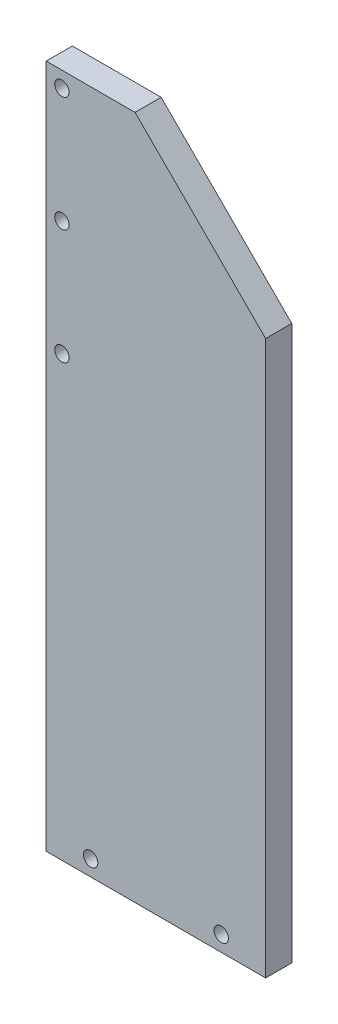
ISO-10303-21;
HEADER;
FILE_DESCRIPTION(('STEP AP214'),'2;1');
FILE_NAME('part.step','',(''),(''),'','','');
FILE_SCHEMA(('AUTOMOTIVE_DESIGN { 1 0 10303 214 1 1 1 1 }'));
ENDSEC;
DATA;
#1=APPLICATION_CONTEXT('core data for automotive mechanical design processes');
#2=APPLICATION_PROTOCOL_DEFINITION('international standard','automotive_design',2000,#1);
#3=PRODUCT_CONTEXT('',#1,'mechanical');
#4=PRODUCT('Part','Part','',(#3));
#5=PRODUCT_RELATED_PRODUCT_CATEGORY('part','',(#4));
#6=PRODUCT_DEFINITION_FORMATION('','',#4);
#7=PRODUCT_DEFINITION_CONTEXT('part definition',#1,'design');
#8=PRODUCT_DEFINITION('design','',#6,#7);
#9=PRODUCT_DEFINITION_SHAPE('','',#8);
#10=(LENGTH_UNIT() NAMED_UNIT(*) SI_UNIT(.MILLI.,.METRE.));
#11=(NAMED_UNIT(*) PLANE_ANGLE_UNIT() SI_UNIT($,.RADIAN.));
#12=(NAMED_UNIT(*) SI_UNIT($,.STERADIAN.) SOLID_ANGLE_UNIT());
#13=UNCERTAINTY_MEASURE_WITH_UNIT(LENGTH_MEASURE(1.E-05),#10,'distance_accuracy_value','');
#14=(GEOMETRIC_REPRESENTATION_CONTEXT(3) GLOBAL_UNCERTAINTY_ASSIGNED_CONTEXT((#13)) GLOBAL_UNIT_ASSIGNED_CONTEXT((#10,
#11,#12)) REPRESENTATION_CONTEXT('',''));
#15=CARTESIAN_POINT('',(0.,0.,0.));
#16=DIRECTION('',(0.,0.,1.));
#17=DIRECTION('',(1.,0.,0.));
#18=AXIS2_PLACEMENT_3D('',#15,#16,#17);
#19=CARTESIAN_POINT('',(42.,0.,0.));
#20=DIRECTION('',(0.,0.,1.));
#21=DIRECTION('',(1.,0.,0.));
#22=AXIS2_PLACEMENT_3D('',#19,#20,#21);
#23=PLANE('',#22);
#24=CARTESIAN_POINT('',(25.,5.99999999999999,0.));
#25=DIRECTION('',(0.,0.,-1.));
#26=DIRECTION('',(-1.,0.,0.));
#27=AXIS2_PLACEMENT_3D('',#24,#25,#26);
#28=CIRCLE('',#27,5.);
#29=CARTESIAN_POINT('',(20.,5.99999999999999,0.));
#30=VERTEX_POINT('',#29);
#31=EDGE_CURVE('E182',#30,#30,#28,.T.);
#32=ORIENTED_EDGE('',*,*,#31,.F.);
#33=EDGE_LOOP('',(#32));
#34=FACE_BOUND('',#33,.T.);
#35=CARTESIAN_POINT('',(-25.,6.,0.));
#36=DIRECTION('',(0.,0.,-1.));
#37=DIRECTION('',(-1.,0.,0.));
#38=AXIS2_PLACEMENT_3D('',#35,#36,#37);
#39=CIRCLE('',#38,5.);
#40=CARTESIAN_POINT('',(-30.,6.,0.));
#41=VERTEX_POINT('',#40);
#42=EDGE_CURVE('E170',#41,#41,#39,.T.);
#43=ORIENTED_EDGE('',*,*,#42,.F.);
#44=EDGE_LOOP('',(#43));
#45=FACE_BOUND('',#44,.T.);
#46=CARTESIAN_POINT('',(-36.,256.,0.));
#47=DIRECTION('',(0.,0.,-1.));
#48=DIRECTION('',(-1.,0.,0.));
#49=AXIS2_PLACEMENT_3D('',#46,#47,#48);
#50=CIRCLE('',#49,4.99999999999999);
#51=CARTESIAN_POINT('',(-41.,256.,0.));
#52=VERTEX_POINT('',#51);
#53=EDGE_CURVE('E158',#52,#52,#50,.T.);
#54=ORIENTED_EDGE('',*,*,#53,.F.);
#55=EDGE_LOOP('',(#54));
#56=FACE_BOUND('',#55,.T.);
#57=CARTESIAN_POINT('',(-36.,212.,0.));
#58=DIRECTION('',(0.,0.,-1.));
#59=DIRECTION('',(-1.,0.,0.));
#60=AXIS2_PLACEMENT_3D('',#57,#58,#59);
#61=CIRCLE('',#60,4.99999999999999);
#62=CARTESIAN_POINT('',(-41.,212.,0.));
#63=VERTEX_POINT('',#62);
#64=EDGE_CURVE('E146',#63,#63,#61,.T.);
#65=ORIENTED_EDGE('',*,*,#64,.F.);
#66=EDGE_LOOP('',(#65));
#67=FACE_BOUND('',#66,.T.);
#68=CARTESIAN_POINT('',(-36.,168.,0.));
#69=DIRECTION('',(0.,0.,-1.));
#70=DIRECTION('',(-1.,0.,0.));
#71=AXIS2_PLACEMENT_3D('',#68,#69,#70);
#72=CIRCLE('',#71,4.99999999999999);
#73=CARTESIAN_POINT('',(-41.,168.,0.));
#74=VERTEX_POINT('',#73);
#75=EDGE_CURVE('E134',#74,#74,#72,.T.);
#76=ORIENTED_EDGE('',*,*,#75,.F.);
#77=EDGE_LOOP('',(#76));
#78=FACE_BOUND('',#77,.T.);
#79=DIRECTION('',(-1.,0.,0.));
#80=VECTOR('',#79,1.);
#81=CARTESIAN_POINT('',(42.,262.,0.));
#82=LINE('',#81,#80);
#83=CARTESIAN_POINT('',(-8.00000000000018,262.,0.));
#84=VERTEX_POINT('',#83);
#85=CARTESIAN_POINT('',(-42.,262.,0.));
#86=VERTEX_POINT('',#85);
#87=EDGE_CURVE('E115',#84,#86,#82,.T.);
#88=ORIENTED_EDGE('',*,*,#87,.F.);
#89=DIRECTION('',(0.707106781186548,-0.707106781186546,0.));
#90=VECTOR('',#89,1.);
#91=CARTESIAN_POINT('',(42.,212.,0.));
#92=LINE('',#91,#90);
#93=CARTESIAN_POINT('',(42.,212.,0.));
#94=VERTEX_POINT('',#93);
#95=EDGE_CURVE('E11',#84,#94,#92,.T.);
#96=ORIENTED_EDGE('',*,*,#95,.T.);
#97=DIRECTION('',(0.,1.,0.));
#98=VECTOR('',#97,1.);
#99=CARTESIAN_POINT('',(42.,0.,0.));
#100=LINE('',#99,#98);
#101=CARTESIAN_POINT('',(42.,0.,0.));
#102=VERTEX_POINT('',#101);
#103=EDGE_CURVE('E85',#102,#94,#100,.T.);
#104=ORIENTED_EDGE('',*,*,#103,.F.);
#105=DIRECTION('',(-1.,0.,0.));
#106=VECTOR('',#105,1.);
#107=CARTESIAN_POINT('',(42.,0.,0.));
#108=LINE('',#107,#106);
#109=CARTESIAN_POINT('',(-42.,0.,0.));
#110=VERTEX_POINT('',#109);
#111=EDGE_CURVE('E95',#102,#110,#108,.T.);
#112=ORIENTED_EDGE('',*,*,#111,.T.);
#113=DIRECTION('',(0.,1.,0.));
#114=VECTOR('',#113,1.);
#115=CARTESIAN_POINT('',(-42.,0.,0.));
#116=LINE('',#115,#114);
#117=EDGE_CURVE('E104',#110,#86,#116,.T.);
#118=ORIENTED_EDGE('',*,*,#117,.T.);
#119=EDGE_LOOP('',(#88,#96,#104,#112,#118));
#120=FACE_BOUND('',#119,.T.);
#121=ADVANCED_FACE('F32',(#34,#45,#56,#67,#78,#120),#23,.F.);
#122=CARTESIAN_POINT('',(42.,262.,0.));
#123=DIRECTION('',(0.,-1.,0.));
#124=DIRECTION('',(0.,0.,-1.));
#125=AXIS2_PLACEMENT_3D('',#122,#123,#124);
#126=PLANE('',#125);
#127=DIRECTION('',(-1.,0.,0.));
#128=VECTOR('',#127,1.);
#129=CARTESIAN_POINT('',(42.,262.,10.));
#130=LINE('',#129,#128);
#131=CARTESIAN_POINT('',(-8.00000000000017,262.,10.));
#132=VERTEX_POINT('',#131);
#133=CARTESIAN_POINT('',(-42.,262.,10.));
#134=VERTEX_POINT('',#133);
#135=EDGE_CURVE('E94',#132,#134,#130,.T.);
#136=ORIENTED_EDGE('',*,*,#135,.F.);
#137=DIRECTION('',(0.,0.,-1.));
#138=VECTOR('',#137,1.);
#139=CARTESIAN_POINT('',(-8.00000000000018,262.,0.));
#140=LINE('',#139,#138);
#141=EDGE_CURVE('E40',#132,#84,#140,.T.);
#142=ORIENTED_EDGE('',*,*,#141,.T.);
#143=ORIENTED_EDGE('',*,*,#87,.T.);
#144=DIRECTION('',(0.,0.,1.));
#145=VECTOR('',#144,1.);
#146=CARTESIAN_POINT('',(-42.,262.,0.));
#147=LINE('',#146,#145);
#148=EDGE_CURVE('E107',#86,#134,#147,.T.);
#149=ORIENTED_EDGE('',*,*,#148,.T.);
#150=EDGE_LOOP('',(#136,#142,#143,#149));
#151=FACE_BOUND('',#150,.T.);
#152=ADVANCED_FACE('F119',(#151),#126,.F.);
#153=CARTESIAN_POINT('',(42.,262.,10.));
#154=DIRECTION('',(0.,0.,-1.));
#155=DIRECTION('',(0.,1.,0.));
#156=AXIS2_PLACEMENT_3D('',#153,#154,#155);
#157=PLANE('',#156);
#158=CARTESIAN_POINT('',(25.,5.99999999999999,10.));
#159=DIRECTION('',(0.,0.,-1.));
#160=DIRECTION('',(-1.,0.,0.));
#161=AXIS2_PLACEMENT_3D('',#158,#159,#160);
#162=CIRCLE('',#161,2.75);
#163=CARTESIAN_POINT('',(22.25,5.99999999999999,10.));
#164=VERTEX_POINT('',#163);
#165=EDGE_CURVE('E173',#164,#164,#162,.T.);
#166=ORIENTED_EDGE('',*,*,#165,.T.);
#167=EDGE_LOOP('',(#166));
#168=FACE_BOUND('',#167,.T.);
#169=CARTESIAN_POINT('',(-25.,6.,10.));
#170=DIRECTION('',(0.,0.,-1.));
#171=DIRECTION('',(-1.,0.,0.));
#172=AXIS2_PLACEMENT_3D('',#169,#170,#171);
#173=CIRCLE('',#172,2.75);
#174=CARTESIAN_POINT('',(-27.75,6.,10.));
#175=VERTEX_POINT('',#174);
#176=EDGE_CURVE('E161',#175,#175,#173,.T.);
#177=ORIENTED_EDGE('',*,*,#176,.T.);
#178=EDGE_LOOP('',(#177));
#179=FACE_BOUND('',#178,.T.);
#180=CARTESIAN_POINT('',(-36.,256.,10.));
#181=DIRECTION('',(0.,0.,-1.));
#182=DIRECTION('',(-1.,0.,0.));
#183=AXIS2_PLACEMENT_3D('',#180,#181,#182);
#184=CIRCLE('',#183,2.75000000000002);
#185=CARTESIAN_POINT('',(-38.75,256.,10.));
#186=VERTEX_POINT('',#185);
#187=EDGE_CURVE('E149',#186,#186,#184,.T.);
#188=ORIENTED_EDGE('',*,*,#187,.T.);
#189=EDGE_LOOP('',(#188));
#190=FACE_BOUND('',#189,.T.);
#191=CARTESIAN_POINT('',(-36.,212.,10.));
#192=DIRECTION('',(0.,0.,-1.));
#193=DIRECTION('',(-1.,0.,0.));
#194=AXIS2_PLACEMENT_3D('',#191,#192,#193);
#195=CIRCLE('',#194,2.75000000000002);
#196=CARTESIAN_POINT('',(-38.75,212.,10.));
#197=VERTEX_POINT('',#196);
#198=EDGE_CURVE('E137',#197,#197,#195,.T.);
#199=ORIENTED_EDGE('',*,*,#198,.T.);
#200=EDGE_LOOP('',(#199));
#201=FACE_BOUND('',#200,.T.);
#202=CARTESIAN_POINT('',(-36.,168.,10.));
#203=DIRECTION('',(0.,0.,-1.));
#204=DIRECTION('',(-1.,0.,0.));
#205=AXIS2_PLACEMENT_3D('',#202,#203,#204);
#206=CIRCLE('',#205,2.75000000000002);
#207=CARTESIAN_POINT('',(-38.75,168.,10.));
#208=VERTEX_POINT('',#207);
#209=EDGE_CURVE('E108',#208,#208,#206,.T.);
#210=ORIENTED_EDGE('',*,*,#209,.T.);
#211=EDGE_LOOP('',(#210));
#212=FACE_BOUND('',#211,.T.);
#213=DIRECTION('',(0.,-1.,0.));
#214=VECTOR('',#213,1.);
#215=CARTESIAN_POINT('',(42.,262.,10.));
#216=LINE('',#215,#214);
#217=CARTESIAN_POINT('',(42.,212.,10.));
#218=VERTEX_POINT('',#217);
#219=CARTESIAN_POINT('',(42.,0.,9.99999999999999));
#220=VERTEX_POINT('',#219);
#221=EDGE_CURVE('E76',#218,#220,#216,.T.);
#222=ORIENTED_EDGE('',*,*,#221,.F.);
#223=DIRECTION('',(-0.707106781186548,0.707106781186546,0.));
#224=VECTOR('',#223,1.);
#225=CARTESIAN_POINT('',(42.,212.,10.));
#226=LINE('',#225,#224);
#227=EDGE_CURVE('E54',#218,#132,#226,.T.);
#228=ORIENTED_EDGE('',*,*,#227,.T.);
#229=ORIENTED_EDGE('',*,*,#135,.T.);
#230=DIRECTION('',(0.,-1.,0.));
#231=VECTOR('',#230,1.);
#232=CARTESIAN_POINT('',(-42.,262.,10.));
#233=LINE('',#232,#231);
#234=CARTESIAN_POINT('',(-42.,0.,9.99999999999999));
#235=VERTEX_POINT('',#234);
#236=EDGE_CURVE('E91',#134,#235,#233,.T.);
#237=ORIENTED_EDGE('',*,*,#236,.T.);
#238=DIRECTION('',(-1.,0.,0.));
#239=VECTOR('',#238,1.);
#240=CARTESIAN_POINT('',(42.,0.,9.99999999999999));
#241=LINE('',#240,#239);
#242=EDGE_CURVE('E88',#220,#235,#241,.T.);
#243=ORIENTED_EDGE('',*,*,#242,.F.);
#244=EDGE_LOOP('',(#222,#228,#229,#237,#243));
#245=FACE_BOUND('',#244,.T.);
#246=ADVANCED_FACE('F89',(#168,#179,#190,#201,#212,#245),#157,.F.);
#247=CARTESIAN_POINT('',(42.,0.,0.));
#248=DIRECTION('',(0.,1.,0.));
#249=DIRECTION('',(0.,0.,1.));
#250=AXIS2_PLACEMENT_3D('',#247,#248,#249);
#251=PLANE('',#250);
#252=DIRECTION('',(0.,0.,-1.));
#253=VECTOR('',#252,1.);
#254=CARTESIAN_POINT('',(-42.,0.,0.));
#255=LINE('',#254,#253);
#256=EDGE_CURVE('E112',#235,#110,#255,.T.);
#257=ORIENTED_EDGE('',*,*,#256,.T.);
#258=ORIENTED_EDGE('',*,*,#111,.F.);
#259=DIRECTION('',(0.,0.,-1.));
#260=VECTOR('',#259,1.);
#261=CARTESIAN_POINT('',(42.,0.,0.));
#262=LINE('',#261,#260);
#263=EDGE_CURVE('E81',#220,#102,#262,.T.);
#264=ORIENTED_EDGE('',*,*,#263,.F.);
#265=ORIENTED_EDGE('',*,*,#242,.T.);
#266=EDGE_LOOP('',(#257,#258,#264,#265));
#267=FACE_BOUND('',#266,.T.);
#268=ADVANCED_FACE('F97',(#267),#251,.F.);
#269=CARTESIAN_POINT('',(42.,262.,0.));
#270=DIRECTION('',(1.,0.,0.));
#271=DIRECTION('',(0.,0.,-1.));
#272=AXIS2_PLACEMENT_3D('',#269,#270,#271);
#273=PLANE('',#272);
#274=ORIENTED_EDGE('',*,*,#103,.T.);
#275=DIRECTION('',(0.,0.,1.));
#276=VECTOR('',#275,1.);
#277=CARTESIAN_POINT('',(42.,212.,10.));
#278=LINE('',#277,#276);
#279=EDGE_CURVE('E84',#94,#218,#278,.T.);
#280=ORIENTED_EDGE('',*,*,#279,.T.);
#281=ORIENTED_EDGE('',*,*,#221,.T.);
#282=ORIENTED_EDGE('',*,*,#263,.T.);
#283=EDGE_LOOP('',(#274,#280,#281,#282));
#284=FACE_BOUND('',#283,.T.);
#285=ADVANCED_FACE('F79',(#284),#273,.T.);
#286=CARTESIAN_POINT('',(-42.,262.,0.));
#287=DIRECTION('',(1.,0.,0.));
#288=DIRECTION('',(0.,0.,-1.));
#289=AXIS2_PLACEMENT_3D('',#286,#287,#288);
#290=PLANE('',#289);
#291=ORIENTED_EDGE('',*,*,#117,.F.);
#292=ORIENTED_EDGE('',*,*,#256,.F.);
#293=ORIENTED_EDGE('',*,*,#236,.F.);
#294=ORIENTED_EDGE('',*,*,#148,.F.);
#295=EDGE_LOOP('',(#291,#292,#293,#294));
#296=FACE_BOUND('',#295,.T.);
#297=ADVANCED_FACE('F124',(#296),#290,.F.);
#298=CARTESIAN_POINT('',(-36.,168.,0.));
#299=DIRECTION('',(0.,0.,-1.));
#300=DIRECTION('',(-1.,0.,0.));
#301=AXIS2_PLACEMENT_3D('',#298,#299,#300);
#302=CYLINDRICAL_SURFACE('',#301,2.75000000000001);
#303=ORIENTED_EDGE('',*,*,#209,.F.);
#304=EDGE_LOOP('',(#303));
#305=FACE_BOUND('',#304,.T.);
#306=CARTESIAN_POINT('',(-36.,168.,5.));
#307=DIRECTION('',(0.,0.,-1.));
#308=DIRECTION('',(-1.,0.,0.));
#309=AXIS2_PLACEMENT_3D('',#306,#307,#308);
#310=CIRCLE('',#309,2.75000000000001);
#311=CARTESIAN_POINT('',(-38.75,168.,5.));
#312=VERTEX_POINT('',#311);
#313=EDGE_CURVE('E128',#312,#312,#310,.T.);
#314=ORIENTED_EDGE('',*,*,#313,.T.);
#315=EDGE_LOOP('',(#314));
#316=FACE_BOUND('',#315,.T.);
#317=ADVANCED_FACE('F211',(#305,#316),#302,.F.);
#318=CARTESIAN_POINT('',(-33.25,168.,5.));
#319=DIRECTION('',(0.,0.,1.));
#320=DIRECTION('',(1.,0.,0.));
#321=AXIS2_PLACEMENT_3D('',#318,#319,#320);
#322=PLANE('',#321);
#323=ORIENTED_EDGE('',*,*,#313,.F.);
#324=EDGE_LOOP('',(#323));
#325=FACE_BOUND('',#324,.T.);
#326=CARTESIAN_POINT('',(-36.,168.,5.));
#327=DIRECTION('',(0.,0.,-1.));
#328=DIRECTION('',(-1.,0.,0.));
#329=AXIS2_PLACEMENT_3D('',#326,#327,#328);
#330=CIRCLE('',#329,4.99999999999999);
#331=CARTESIAN_POINT('',(-41.,168.,5.));
#332=VERTEX_POINT('',#331);
#333=EDGE_CURVE('E131',#332,#332,#330,.T.);
#334=ORIENTED_EDGE('',*,*,#333,.T.);
#335=EDGE_LOOP('',(#334));
#336=FACE_BOUND('',#335,.T.);
#337=ADVANCED_FACE('F201',(#325,#336),#322,.F.);
#338=CARTESIAN_POINT('',(-36.,168.,0.));
#339=DIRECTION('',(0.,0.,-1.));
#340=DIRECTION('',(-1.,0.,0.));
#341=AXIS2_PLACEMENT_3D('',#338,#339,#340);
#342=CYLINDRICAL_SURFACE('',#341,4.99999999999999);
#343=ORIENTED_EDGE('',*,*,#333,.F.);
#344=EDGE_LOOP('',(#343));
#345=FACE_BOUND('',#344,.T.);
#346=ORIENTED_EDGE('',*,*,#75,.T.);
#347=EDGE_LOOP('',(#346));
#348=FACE_BOUND('',#347,.T.);
#349=ADVANCED_FACE('F198',(#345,#348),#342,.F.);
#350=CARTESIAN_POINT('',(-36.,212.,0.));
#351=DIRECTION('',(0.,0.,-1.));
#352=DIRECTION('',(-1.,0.,0.));
#353=AXIS2_PLACEMENT_3D('',#350,#351,#352);
#354=CYLINDRICAL_SURFACE('',#353,2.75000000000001);
#355=ORIENTED_EDGE('',*,*,#198,.F.);
#356=EDGE_LOOP('',(#355));
#357=FACE_BOUND('',#356,.T.);
#358=CARTESIAN_POINT('',(-36.,212.,5.));
#359=DIRECTION('',(0.,0.,-1.));
#360=DIRECTION('',(-1.,0.,0.));
#361=AXIS2_PLACEMENT_3D('',#358,#359,#360);
#362=CIRCLE('',#361,2.75000000000001);
#363=CARTESIAN_POINT('',(-38.75,212.,5.));
#364=VERTEX_POINT('',#363);
#365=EDGE_CURVE('E140',#364,#364,#362,.T.);
#366=ORIENTED_EDGE('',*,*,#365,.T.);
#367=EDGE_LOOP('',(#366));
#368=FACE_BOUND('',#367,.T.);
#369=ADVANCED_FACE('F200',(#357,#368),#354,.F.);
#370=CARTESIAN_POINT('',(-33.25,212.,5.));
#371=DIRECTION('',(0.,0.,1.));
#372=DIRECTION('',(1.,0.,0.));
#373=AXIS2_PLACEMENT_3D('',#370,#371,#372);
#374=PLANE('',#373);
#375=ORIENTED_EDGE('',*,*,#365,.F.);
#376=EDGE_LOOP('',(#375));
#377=FACE_BOUND('',#376,.T.);
#378=CARTESIAN_POINT('',(-36.,212.,5.));
#379=DIRECTION('',(0.,0.,-1.));
#380=DIRECTION('',(-1.,0.,0.));
#381=AXIS2_PLACEMENT_3D('',#378,#379,#380);
#382=CIRCLE('',#381,4.99999999999999);
#383=CARTESIAN_POINT('',(-41.,212.,5.));
#384=VERTEX_POINT('',#383);
#385=EDGE_CURVE('E143',#384,#384,#382,.T.);
#386=ORIENTED_EDGE('',*,*,#385,.T.);
#387=EDGE_LOOP('',(#386));
#388=FACE_BOUND('',#387,.T.);
#389=ADVANCED_FACE('F208',(#377,#388),#374,.F.);
#390=CARTESIAN_POINT('',(-36.,212.,0.));
#391=DIRECTION('',(0.,0.,-1.));
#392=DIRECTION('',(-1.,0.,0.));
#393=AXIS2_PLACEMENT_3D('',#390,#391,#392);
#394=CYLINDRICAL_SURFACE('',#393,4.99999999999999);
#395=ORIENTED_EDGE('',*,*,#385,.F.);
#396=EDGE_LOOP('',(#395));
#397=FACE_BOUND('',#396,.T.);
#398=ORIENTED_EDGE('',*,*,#64,.T.);
#399=EDGE_LOOP('',(#398));
#400=FACE_BOUND('',#399,.T.);
#401=ADVANCED_FACE('F278',(#397,#400),#394,.F.);
#402=CARTESIAN_POINT('',(-36.,256.,0.));
#403=DIRECTION('',(0.,0.,-1.));
#404=DIRECTION('',(-1.,0.,0.));
#405=AXIS2_PLACEMENT_3D('',#402,#403,#404);
#406=CYLINDRICAL_SURFACE('',#405,2.75000000000001);
#407=ORIENTED_EDGE('',*,*,#187,.F.);
#408=EDGE_LOOP('',(#407));
#409=FACE_BOUND('',#408,.T.);
#410=CARTESIAN_POINT('',(-36.,256.,5.));
#411=DIRECTION('',(0.,0.,-1.));
#412=DIRECTION('',(-1.,0.,0.));
#413=AXIS2_PLACEMENT_3D('',#410,#411,#412);
#414=CIRCLE('',#413,2.75000000000001);
#415=CARTESIAN_POINT('',(-38.75,256.,5.));
#416=VERTEX_POINT('',#415);
#417=EDGE_CURVE('E152',#416,#416,#414,.T.);
#418=ORIENTED_EDGE('',*,*,#417,.T.);
#419=EDGE_LOOP('',(#418));
#420=FACE_BOUND('',#419,.T.);
#421=ADVANCED_FACE('F287',(#409,#420),#406,.F.);
#422=CARTESIAN_POINT('',(-33.25,256.,5.));
#423=DIRECTION('',(0.,0.,1.));
#424=DIRECTION('',(1.,0.,0.));
#425=AXIS2_PLACEMENT_3D('',#422,#423,#424);
#426=PLANE('',#425);
#427=ORIENTED_EDGE('',*,*,#417,.F.);
#428=EDGE_LOOP('',(#427));
#429=FACE_BOUND('',#428,.T.);
#430=CARTESIAN_POINT('',(-36.,256.,5.));
#431=DIRECTION('',(0.,0.,-1.));
#432=DIRECTION('',(-1.,0.,0.));
#433=AXIS2_PLACEMENT_3D('',#430,#431,#432);
#434=CIRCLE('',#433,4.99999999999999);
#435=CARTESIAN_POINT('',(-41.,256.,5.));
#436=VERTEX_POINT('',#435);
#437=EDGE_CURVE('E155',#436,#436,#434,.T.);
#438=ORIENTED_EDGE('',*,*,#437,.T.);
#439=EDGE_LOOP('',(#438));
#440=FACE_BOUND('',#439,.T.);
#441=ADVANCED_FACE('F297',(#429,#440),#426,.F.);
#442=CARTESIAN_POINT('',(-36.,256.,0.));
#443=DIRECTION('',(0.,0.,-1.));
#444=DIRECTION('',(-1.,0.,0.));
#445=AXIS2_PLACEMENT_3D('',#442,#443,#444);
#446=CYLINDRICAL_SURFACE('',#445,4.99999999999999);
#447=ORIENTED_EDGE('',*,*,#437,.F.);
#448=EDGE_LOOP('',(#447));
#449=FACE_BOUND('',#448,.T.);
#450=ORIENTED_EDGE('',*,*,#53,.T.);
#451=EDGE_LOOP('',(#450));
#452=FACE_BOUND('',#451,.T.);
#453=ADVANCED_FACE('F307',(#449,#452),#446,.F.);
#454=CARTESIAN_POINT('',(-25.,6.,0.));
#455=DIRECTION('',(0.,0.,-1.));
#456=DIRECTION('',(-1.,0.,0.));
#457=AXIS2_PLACEMENT_3D('',#454,#455,#456);
#458=CYLINDRICAL_SURFACE('',#457,2.75);
#459=ORIENTED_EDGE('',*,*,#176,.F.);
#460=EDGE_LOOP('',(#459));
#461=FACE_BOUND('',#460,.T.);
#462=CARTESIAN_POINT('',(-25.,6.,5.));
#463=DIRECTION('',(0.,0.,-1.));
#464=DIRECTION('',(-1.,0.,0.));
#465=AXIS2_PLACEMENT_3D('',#462,#463,#464);
#466=CIRCLE('',#465,2.75);
#467=CARTESIAN_POINT('',(-27.75,6.,5.));
#468=VERTEX_POINT('',#467);
#469=EDGE_CURVE('E164',#468,#468,#466,.T.);
#470=ORIENTED_EDGE('',*,*,#469,.T.);
#471=EDGE_LOOP('',(#470));
#472=FACE_BOUND('',#471,.T.);
#473=ADVANCED_FACE('F317',(#461,#472),#458,.F.);
#474=CARTESIAN_POINT('',(-22.25,6.,5.));
#475=DIRECTION('',(0.,0.,1.));
#476=DIRECTION('',(1.,0.,0.));
#477=AXIS2_PLACEMENT_3D('',#474,#475,#476);
#478=PLANE('',#477);
#479=ORIENTED_EDGE('',*,*,#469,.F.);
#480=EDGE_LOOP('',(#479));
#481=FACE_BOUND('',#480,.T.);
#482=CARTESIAN_POINT('',(-25.,6.,5.));
#483=DIRECTION('',(0.,0.,-1.));
#484=DIRECTION('',(-1.,0.,0.));
#485=AXIS2_PLACEMENT_3D('',#482,#483,#484);
#486=CIRCLE('',#485,5.);
#487=CARTESIAN_POINT('',(-30.,6.,5.));
#488=VERTEX_POINT('',#487);
#489=EDGE_CURVE('E167',#488,#488,#486,.T.);
#490=ORIENTED_EDGE('',*,*,#489,.T.);
#491=EDGE_LOOP('',(#490));
#492=FACE_BOUND('',#491,.T.);
#493=ADVANCED_FACE('F327',(#481,#492),#478,.F.);
#494=CARTESIAN_POINT('',(-25.,6.,0.));
#495=DIRECTION('',(0.,0.,-1.));
#496=DIRECTION('',(-1.,0.,0.));
#497=AXIS2_PLACEMENT_3D('',#494,#495,#496);
#498=CYLINDRICAL_SURFACE('',#497,5.);
#499=ORIENTED_EDGE('',*,*,#489,.F.);
#500=EDGE_LOOP('',(#499));
#501=FACE_BOUND('',#500,.T.);
#502=ORIENTED_EDGE('',*,*,#42,.T.);
#503=EDGE_LOOP('',(#502));
#504=FACE_BOUND('',#503,.T.);
#505=ADVANCED_FACE('F337',(#501,#504),#498,.F.);
#506=CARTESIAN_POINT('',(25.,5.99999999999999,0.));
#507=DIRECTION('',(0.,0.,-1.));
#508=DIRECTION('',(-1.,0.,0.));
#509=AXIS2_PLACEMENT_3D('',#506,#507,#508);
#510=CYLINDRICAL_SURFACE('',#509,2.75);
#511=ORIENTED_EDGE('',*,*,#165,.F.);
#512=EDGE_LOOP('',(#511));
#513=FACE_BOUND('',#512,.T.);
#514=CARTESIAN_POINT('',(25.,5.99999999999999,5.));
#515=DIRECTION('',(0.,0.,-1.));
#516=DIRECTION('',(-1.,0.,0.));
#517=AXIS2_PLACEMENT_3D('',#514,#515,#516);
#518=CIRCLE('',#517,2.75);
#519=CARTESIAN_POINT('',(22.25,5.99999999999999,5.));
#520=VERTEX_POINT('',#519);
#521=EDGE_CURVE('E176',#520,#520,#518,.T.);
#522=ORIENTED_EDGE('',*,*,#521,.T.);
#523=EDGE_LOOP('',(#522));
#524=FACE_BOUND('',#523,.T.);
#525=ADVANCED_FACE('F347',(#513,#524),#510,.F.);
#526=CARTESIAN_POINT('',(27.75,5.99999999999999,5.));
#527=DIRECTION('',(0.,0.,1.));
#528=DIRECTION('',(1.,0.,0.));
#529=AXIS2_PLACEMENT_3D('',#526,#527,#528);
#530=PLANE('',#529);
#531=ORIENTED_EDGE('',*,*,#521,.F.);
#532=EDGE_LOOP('',(#531));
#533=FACE_BOUND('',#532,.T.);
#534=CARTESIAN_POINT('',(25.,5.99999999999999,5.));
#535=DIRECTION('',(0.,0.,-1.));
#536=DIRECTION('',(-1.,0.,0.));
#537=AXIS2_PLACEMENT_3D('',#534,#535,#536);
#538=CIRCLE('',#537,5.);
#539=CARTESIAN_POINT('',(20.,5.99999999999999,5.));
#540=VERTEX_POINT('',#539);
#541=EDGE_CURVE('E179',#540,#540,#538,.T.);
#542=ORIENTED_EDGE('',*,*,#541,.T.);
#543=EDGE_LOOP('',(#542));
#544=FACE_BOUND('',#543,.T.);
#545=ADVANCED_FACE('F357',(#533,#544),#530,.F.);
#546=CARTESIAN_POINT('',(25.,5.99999999999999,0.));
#547=DIRECTION('',(0.,0.,-1.));
#548=DIRECTION('',(-1.,0.,0.));
#549=AXIS2_PLACEMENT_3D('',#546,#547,#548);
#550=CYLINDRICAL_SURFACE('',#549,5.);
#551=ORIENTED_EDGE('',*,*,#541,.F.);
#552=EDGE_LOOP('',(#551));
#553=FACE_BOUND('',#552,.T.);
#554=ORIENTED_EDGE('',*,*,#31,.T.);
#555=EDGE_LOOP('',(#554));
#556=FACE_BOUND('',#555,.T.);
#557=ADVANCED_FACE('F186',(#553,#556),#550,.F.);
#558=CARTESIAN_POINT('',(42.,212.,0.));
#559=DIRECTION('',(0.707106781186546,0.707106781186548,0.));
#560=DIRECTION('',(-0.707106781186549,0.707106781186547,0.));
#561=AXIS2_PLACEMENT_3D('',#558,#559,#560);
#562=PLANE('',#561);
#563=ORIENTED_EDGE('',*,*,#95,.F.);
#564=ORIENTED_EDGE('',*,*,#141,.F.);
#565=ORIENTED_EDGE('',*,*,#227,.F.);
#566=ORIENTED_EDGE('',*,*,#279,.F.);
#567=EDGE_LOOP('',(#563,#564,#565,#566));
#568=FACE_BOUND('',#567,.T.);
#569=ADVANCED_FACE('F34',(#568),#562,.T.);
#570=CLOSED_SHELL('',(#121,#152,#246,#268,#285,#297,#317,#337,#349,#369,#389,#401,#421,#441,
#453,#473,#493,#505,#525,#545,#557,#569));
#571=MANIFOLD_SOLID_BREP('B2',#570);
#572=ADVANCED_BREP_SHAPE_REPRESENTATION('',(#18,#571),#14);
#573=SHAPE_DEFINITION_REPRESENTATION(#9,#572);
ENDSEC;
END-ISO-10303-21;
